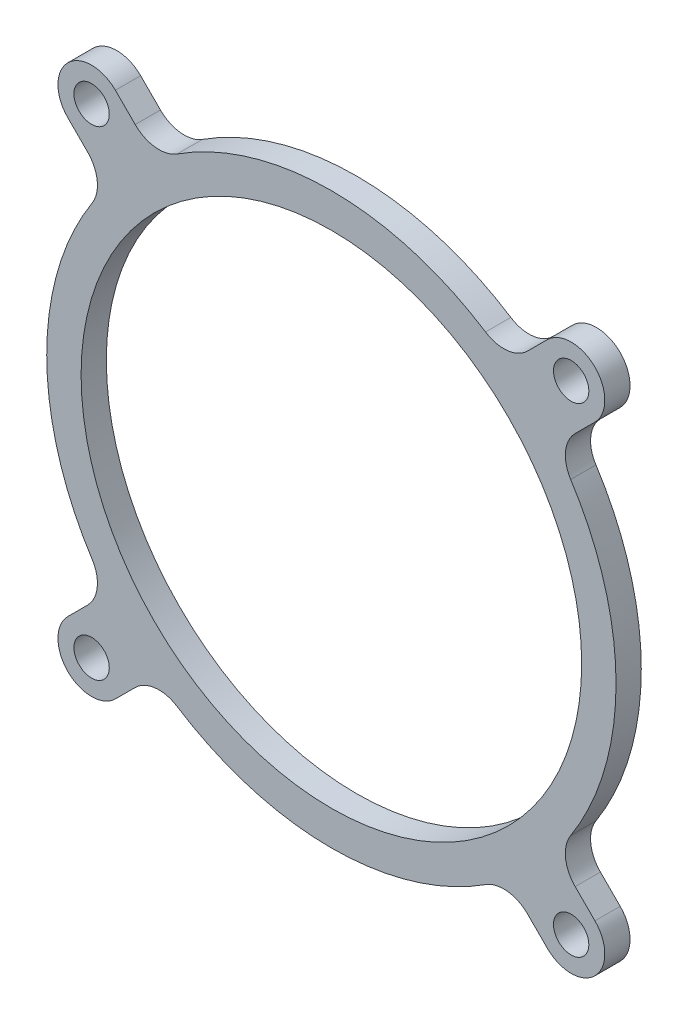
ISO-10303-21;
HEADER;
FILE_DESCRIPTION(('STEP AP214'),'2;1');
FILE_NAME('part.step','',(''),(''),'','','');
FILE_SCHEMA(('AUTOMOTIVE_DESIGN { 1 0 10303 214 1 1 1 1 }'));
ENDSEC;
DATA;
#1=APPLICATION_CONTEXT('core data for automotive mechanical design processes');
#2=APPLICATION_PROTOCOL_DEFINITION('international standard','automotive_design',2000,#1);
#3=PRODUCT_CONTEXT('',#1,'mechanical');
#4=PRODUCT('Part','Part','',(#3));
#5=PRODUCT_RELATED_PRODUCT_CATEGORY('part','',(#4));
#6=PRODUCT_DEFINITION_FORMATION('','',#4);
#7=PRODUCT_DEFINITION_CONTEXT('part definition',#1,'design');
#8=PRODUCT_DEFINITION('design','',#6,#7);
#9=PRODUCT_DEFINITION_SHAPE('','',#8);
#10=(LENGTH_UNIT() NAMED_UNIT(*) SI_UNIT(.MILLI.,.METRE.));
#11=(NAMED_UNIT(*) PLANE_ANGLE_UNIT() SI_UNIT($,.RADIAN.));
#12=(NAMED_UNIT(*) SI_UNIT($,.STERADIAN.) SOLID_ANGLE_UNIT());
#13=UNCERTAINTY_MEASURE_WITH_UNIT(LENGTH_MEASURE(1.E-05),#10,'distance_accuracy_value','');
#14=(GEOMETRIC_REPRESENTATION_CONTEXT(3) GLOBAL_UNCERTAINTY_ASSIGNED_CONTEXT((#13)) GLOBAL_UNIT_ASSIGNED_CONTEXT((#10,
#11,#12)) REPRESENTATION_CONTEXT('',''));
#15=CARTESIAN_POINT('',(0.,0.,0.));
#16=DIRECTION('',(0.,0.,1.));
#17=DIRECTION('',(1.,0.,0.));
#18=AXIS2_PLACEMENT_3D('',#15,#16,#17);
#19=CARTESIAN_POINT('',(52.049747468308,-52.0497474683077,3.));
#20=DIRECTION('',(0.,0.,1.));
#21=DIRECTION('',(1.,0.,0.));
#22=AXIS2_PLACEMENT_3D('',#19,#20,#21);
#23=PLANE('',#22);
#24=CARTESIAN_POINT('',(-4.94974746830807,4.94974746830784,3.));
#25=DIRECTION('',(0.,0.,1.));
#26=DIRECTION('',(1.,0.,0.));
#27=AXIS2_PLACEMENT_3D('',#24,#25,#26);
#28=CIRCLE('',#27,2.10000000000181);
#29=CARTESIAN_POINT('',(-2.84974746830626,4.94974746830784,3.));
#30=VERTEX_POINT('',#29);
#31=EDGE_CURVE('E455',#30,#30,#28,.T.);
#32=ORIENTED_EDGE('',*,*,#31,.F.);
#33=EDGE_LOOP('',(#32));
#34=FACE_BOUND('',#33,.T.);
#35=CARTESIAN_POINT('',(52.049747468308,-52.0497474683077,3.));
#36=DIRECTION('',(0.,0.,1.));
#37=DIRECTION('',(1.,0.,0.));
#38=AXIS2_PLACEMENT_3D('',#35,#36,#37);
#39=CIRCLE('',#38,2.0999999999985);
#40=CARTESIAN_POINT('',(54.1497474683065,-52.0497474683077,3.));
#41=VERTEX_POINT('',#40);
#42=EDGE_CURVE('E467',#41,#41,#39,.T.);
#43=ORIENTED_EDGE('',*,*,#42,.F.);
#44=EDGE_LOOP('',(#43));
#45=FACE_BOUND('',#44,.T.);
#46=CARTESIAN_POINT('',(52.049747468308,-52.0497474683077,3.));
#47=DIRECTION('',(0.,0.,1.));
#48=DIRECTION('',(1.,0.,0.));
#49=AXIS2_PLACEMENT_3D('',#46,#47,#48);
#50=CIRCLE('',#49,3.99999999998963);
#51=CARTESIAN_POINT('',(49.2213203435691,-54.8781745930466,3.));
#52=VERTEX_POINT('',#51);
#53=CARTESIAN_POINT('',(54.8781745930468,-49.2213203435689,3.));
#54=VERTEX_POINT('',#53);
#55=EDGE_CURVE('E277',#52,#54,#50,.T.);
#56=ORIENTED_EDGE('',*,*,#55,.T.);
#57=DIRECTION('',(-0.707106781186531,0.707106781186564,0.));
#58=VECTOR('',#57,1.);
#59=CARTESIAN_POINT('',(54.8781745930468,-49.2213203435689,3.));
#60=LINE('',#59,#58);
#61=CARTESIAN_POINT('',(52.526918716007,-46.870064466529,3.));
#62=VERTEX_POINT('',#61);
#63=EDGE_CURVE('E145',#54,#62,#60,.T.);
#64=ORIENTED_EDGE('',*,*,#63,.T.);
#65=CARTESIAN_POINT('',(55.3553458407532,-44.0416373417828,3.));
#66=DIRECTION('',(0.,0.,-1.));
#67=DIRECTION('',(1.,0.,0.));
#68=AXIS2_PLACEMENT_3D('',#65,#66,#67);
#69=CIRCLE('',#68,3.99999999999999);
#70=CARTESIAN_POINT('',(51.9928142334286,-41.8752160554806,3.));
#71=VERTEX_POINT('',#70);
#72=EDGE_CURVE('E340',#62,#71,#69,.T.);
#73=ORIENTED_EDGE('',*,*,#72,.T.);
#74=CARTESIAN_POINT('',(23.5499999999334,-23.5499999999476,3.));
#75=DIRECTION('',(0.,0.,1.));
#76=DIRECTION('',(1.,0.,0.));
#77=AXIS2_PLACEMENT_3D('',#74,#75,#76);
#78=CIRCLE('',#77,33.8350000000456);
#79=CARTESIAN_POINT('',(51.9928142335033,-5.22478394453042,3.));
#80=VERTEX_POINT('',#79);
#81=EDGE_CURVE('E359',#71,#80,#78,.T.);
#82=ORIENTED_EDGE('',*,*,#81,.T.);
#83=CARTESIAN_POINT('',(55.3553458408367,-3.05836265824198,3.));
#84=DIRECTION('',(0.,0.,-1.));
#85=DIRECTION('',(1.,0.,0.));
#86=AXIS2_PLACEMENT_3D('',#83,#84,#85);
#87=CIRCLE('',#86,4.);
#88=CARTESIAN_POINT('',(52.5269187160905,-0.22993553349579,3.));
#89=VERTEX_POINT('',#88);
#90=EDGE_CURVE('E356',#80,#89,#87,.T.);
#91=ORIENTED_EDGE('',*,*,#90,.T.);
#92=DIRECTION('',(0.707106781186545,0.70710678118655,0.));
#93=VECTOR('',#92,1.);
#94=CARTESIAN_POINT('',(54.8781745931514,2.12132034356506,3.));
#95=LINE('',#94,#93);
#96=CARTESIAN_POINT('',(54.8781745931516,2.12132034356488,3.));
#97=VERTEX_POINT('',#96);
#98=EDGE_CURVE('E358',#89,#97,#95,.T.);
#99=ORIENTED_EDGE('',*,*,#98,.T.);
#100=CARTESIAN_POINT('',(52.0497474684125,4.94974746830361,3.));
#101=DIRECTION('',(0.,0.,1.));
#102=DIRECTION('',(1.,0.,0.));
#103=AXIS2_PLACEMENT_3D('',#100,#101,#102);
#104=CIRCLE('',#103,3.99999999998965);
#105=CARTESIAN_POINT('',(49.2213203436736,7.7781745930428,3.));
#106=VERTEX_POINT('',#105);
#107=EDGE_CURVE('E361',#97,#106,#104,.T.);
#108=ORIENTED_EDGE('',*,*,#107,.T.);
#109=DIRECTION('',(-0.707106781186541,-0.707106781186554,0.));
#110=VECTOR('',#109,1.);
#111=CARTESIAN_POINT('',(49.2213203436736,7.7781745930428,3.));
#112=LINE('',#111,#110);
#113=CARTESIAN_POINT('',(46.8700644666735,5.42691871604261,3.));
#114=VERTEX_POINT('',#113);
#115=EDGE_CURVE('E367',#106,#114,#112,.T.);
#116=ORIENTED_EDGE('',*,*,#115,.T.);
#117=CARTESIAN_POINT('',(44.0416373419273,8.2553458407888,3.));
#118=DIRECTION('',(0.,0.,-1.));
#119=DIRECTION('',(1.,0.,0.));
#120=AXIS2_PLACEMENT_3D('',#117,#118,#119);
#121=CIRCLE('',#120,3.99999999999999);
#122=CARTESIAN_POINT('',(41.875216055624,4.89281423346494,3.));
#123=VERTEX_POINT('',#122);
#124=EDGE_CURVE('E369',#114,#123,#121,.T.);
#125=ORIENTED_EDGE('',*,*,#124,.T.);
#126=CARTESIAN_POINT('',(23.5500000000813,-23.5500000000242,3.));
#127=DIRECTION('',(0.,0.,1.));
#128=DIRECTION('',(-1.,0.,0.));
#129=AXIS2_PLACEMENT_3D('',#126,#127,#128);
#130=CIRCLE('',#129,33.8350000000457);
#131=CARTESIAN_POINT('',(5.22478394462314,4.8928142335194,3.));
#132=VERTEX_POINT('',#131);
#133=EDGE_CURVE('E371',#123,#132,#130,.T.);
#134=ORIENTED_EDGE('',*,*,#133,.T.);
#135=CARTESIAN_POINT('',(3.05836265832984,8.2553458408497,3.));
#136=DIRECTION('',(0.,0.,-1.));
#137=DIRECTION('',(1.,0.,0.));
#138=AXIS2_PLACEMENT_3D('',#135,#136,#137);
#139=CIRCLE('',#138,4.);
#140=CARTESIAN_POINT('',(0.229935533583649,5.42691871610351,3.));
#141=VERTEX_POINT('',#140);
#142=EDGE_CURVE('E373',#132,#141,#139,.T.);
#143=ORIENTED_EDGE('',*,*,#142,.T.);
#144=DIRECTION('',(-0.707106781186566,0.707106781186529,0.));
#145=VECTOR('',#144,1.);
#146=CARTESIAN_POINT('',(-2.12132034346029,7.77817459314733,3.));
#147=LINE('',#146,#145);
#148=CARTESIAN_POINT('',(-2.12132034346029,7.77817459314732,3.));
#149=VERTEX_POINT('',#148);
#150=EDGE_CURVE('E375',#141,#149,#147,.T.);
#151=ORIENTED_EDGE('',*,*,#150,.T.);
#152=CARTESIAN_POINT('',(-4.94974746819915,4.94974746840844,3.));
#153=DIRECTION('',(0.,0.,1.));
#154=DIRECTION('',(1.,0.,0.));
#155=AXIS2_PLACEMENT_3D('',#152,#153,#154);
#156=CIRCLE('',#155,3.99999999998964);
#157=CARTESIAN_POINT('',(-7.77817459293803,2.1213203436696,3.));
#158=VERTEX_POINT('',#157);
#159=EDGE_CURVE('E377',#149,#158,#156,.T.);
#160=ORIENTED_EDGE('',*,*,#159,.T.);
#161=DIRECTION('',(0.707106781186545,-0.70710678118655,0.));
#162=VECTOR('',#161,1.);
#163=CARTESIAN_POINT('',(-7.77817459293803,2.1213203436696,3.));
#164=LINE('',#163,#162);
#165=CARTESIAN_POINT('',(-5.42691871592922,-0.229935533339226,3.));
#166=VERTEX_POINT('',#165);
#167=EDGE_CURVE('E379',#158,#166,#164,.T.);
#168=ORIENTED_EDGE('',*,*,#167,.T.);
#169=CARTESIAN_POINT('',(-8.25534584067542,-3.05836265808541,3.));
#170=DIRECTION('',(0.,0.,-1.));
#171=DIRECTION('',(1.,0.,0.));
#172=AXIS2_PLACEMENT_3D('',#169,#170,#171);
#173=CIRCLE('',#172,4.);
#174=CARTESIAN_POINT('',(-4.89281423335789,-5.22478394439853,3.));
#175=VERTEX_POINT('',#174);
#176=EDGE_CURVE('E381',#166,#175,#173,.T.);
#177=ORIENTED_EDGE('',*,*,#176,.T.);
#178=CARTESIAN_POINT('',(23.55000000004,-23.5500000000001,3.));
#179=DIRECTION('',(0.,0.,1.));
#180=DIRECTION('',(1.,0.,0.));
#181=AXIS2_PLACEMENT_3D('',#178,#179,#180);
#182=CIRCLE('',#181,33.8350000000009);
#183=CARTESIAN_POINT('',(-4.89281423346648,-41.8752160554331,3.));
#184=VERTEX_POINT('',#183);
#185=EDGE_CURVE('E383',#175,#184,#182,.T.);
#186=ORIENTED_EDGE('',*,*,#185,.T.);
#187=CARTESIAN_POINT('',(-8.25534584079685,-44.0416373417262,3.));
#188=DIRECTION('',(0.,0.,-1.));
#189=DIRECTION('',(1.,0.,0.));
#190=AXIS2_PLACEMENT_3D('',#187,#188,#189);
#191=CIRCLE('',#190,4.);
#192=CARTESIAN_POINT('',(-5.42691871605065,-46.8700644664724,3.));
#193=VERTEX_POINT('',#192);
#194=EDGE_CURVE('E385',#184,#193,#191,.T.);
#195=ORIENTED_EDGE('',*,*,#194,.T.);
#196=DIRECTION('',(-0.707106781186544,-0.707106781186551,0.));
#197=VECTOR('',#196,1.);
#198=CARTESIAN_POINT('',(-7.77817459304254,-49.2213203434643,3.));
#199=LINE('',#198,#197);
#200=CARTESIAN_POINT('',(-7.77817459304274,-49.2213203434641,3.));
#201=VERTEX_POINT('',#200);
#202=EDGE_CURVE('E387',#193,#201,#199,.T.);
#203=ORIENTED_EDGE('',*,*,#202,.T.);
#204=CARTESIAN_POINT('',(-4.94974746830362,-52.0497474682028,3.));
#205=DIRECTION('',(0.,0.,1.));
#206=DIRECTION('',(1.,0.,0.));
#207=AXIS2_PLACEMENT_3D('',#204,#205,#206);
#208=CIRCLE('',#207,3.99999999998964);
#209=CARTESIAN_POINT('',(-2.1213203435648,-54.8781745929421,3.));
#210=VERTEX_POINT('',#209);
#211=EDGE_CURVE('E389',#201,#210,#208,.T.);
#212=ORIENTED_EDGE('',*,*,#211,.T.);
#213=DIRECTION('',(0.707106781186544,0.707106781186551,0.));
#214=VECTOR('',#213,1.);
#215=CARTESIAN_POINT('',(-2.1213203435648,-54.8781745929421,3.));
#216=LINE('',#215,#214);
#217=CARTESIAN_POINT('',(0.229935533390949,-52.5269187159863,3.));
#218=VERTEX_POINT('',#217);
#219=EDGE_CURVE('E391',#210,#218,#216,.T.);
#220=ORIENTED_EDGE('',*,*,#219,.T.);
#221=CARTESIAN_POINT('',(3.05836265813714,-55.3553458407325,3.));
#222=DIRECTION('',(0.,0.,-1.));
#223=DIRECTION('',(1.,0.,0.));
#224=AXIS2_PLACEMENT_3D('',#221,#222,#223);
#225=CIRCLE('',#224,3.99999999999999);
#226=CARTESIAN_POINT('',(5.22478394444227,-51.9928142334098,3.));
#227=VERTEX_POINT('',#226);
#228=EDGE_CURVE('E212',#218,#227,#225,.T.);
#229=ORIENTED_EDGE('',*,*,#228,.T.);
#230=CARTESIAN_POINT('',(23.5499999999759,-23.5499999999693,3.));
#231=DIRECTION('',(0.,0.,1.));
#232=DIRECTION('',(1.,0.,0.));
#233=AXIS2_PLACEMENT_3D('',#230,#231,#232);
#234=CIRCLE('',#233,33.8349999999999);
#235=CARTESIAN_POINT('',(41.8752160554813,-51.992814233428,3.));
#236=VERTEX_POINT('',#235);
#237=EDGE_CURVE('E206',#227,#236,#234,.T.);
#238=ORIENTED_EDGE('',*,*,#237,.T.);
#239=CARTESIAN_POINT('',(44.0416373417831,-55.3553458407528,3.));
#240=DIRECTION('',(0.,0.,-1.));
#241=DIRECTION('',(1.,0.,0.));
#242=AXIS2_PLACEMENT_3D('',#239,#240,#241);
#243=CIRCLE('',#242,4.);
#244=CARTESIAN_POINT('',(46.8700644665293,-52.5269187160066,3.));
#245=VERTEX_POINT('',#244);
#246=EDGE_CURVE('E210',#236,#245,#243,.T.);
#247=ORIENTED_EDGE('',*,*,#246,.T.);
#248=DIRECTION('',(0.707106781186534,-0.707106781186561,0.));
#249=VECTOR('',#248,1.);
#250=CARTESIAN_POINT('',(49.2213203435691,-54.8781745930466,3.));
#251=LINE('',#250,#249);
#252=EDGE_CURVE('E54',#245,#52,#251,.T.);
#253=ORIENTED_EDGE('',*,*,#252,.T.);
#254=EDGE_LOOP('',(#56,#64,#73,#82,#91,#99,#108,#116,#125,#134,#143,#151,#160,#168,#177,#186,
#195,#203,#212,#220,#229,#238,#247,#253));
#255=FACE_BOUND('',#254,.T.);
#256=CARTESIAN_POINT('',(23.5500000000813,-23.5500000000242,3.));
#257=DIRECTION('',(0.,0.,1.));
#258=DIRECTION('',(1.,0.,0.));
#259=AXIS2_PLACEMENT_3D('',#256,#257,#258);
#260=CIRCLE('',#259,29.75);
#261=CARTESIAN_POINT('',(53.3000000000813,-23.5500000000242,3.));
#262=VERTEX_POINT('',#261);
#263=EDGE_CURVE('E234',#262,#262,#260,.T.);
#264=ORIENTED_EDGE('',*,*,#263,.F.);
#265=EDGE_LOOP('',(#264));
#266=FACE_BOUND('',#265,.T.);
#267=CARTESIAN_POINT('',(-4.94974746830785,-52.0497474683081,3.));
#268=DIRECTION('',(0.,0.,1.));
#269=DIRECTION('',(1.,0.,0.));
#270=AXIS2_PLACEMENT_3D('',#267,#268,#269);
#271=CIRCLE('',#270,2.10000000000254);
#272=CARTESIAN_POINT('',(-2.84974746830531,-52.0497474683081,3.));
#273=VERTEX_POINT('',#272);
#274=EDGE_CURVE('E461',#273,#273,#271,.T.);
#275=ORIENTED_EDGE('',*,*,#274,.F.);
#276=EDGE_LOOP('',(#275));
#277=FACE_BOUND('',#276,.T.);
#278=CARTESIAN_POINT('',(52.0497474683079,4.94974746830806,3.));
#279=DIRECTION('',(0.,0.,1.));
#280=DIRECTION('',(1.,0.,0.));
#281=AXIS2_PLACEMENT_3D('',#278,#279,#280);
#282=CIRCLE('',#281,2.09999999999761);
#283=CARTESIAN_POINT('',(54.1497474683055,4.94974746830806,3.));
#284=VERTEX_POINT('',#283);
#285=EDGE_CURVE('E446',#284,#284,#282,.T.);
#286=ORIENTED_EDGE('',*,*,#285,.F.);
#287=EDGE_LOOP('',(#286));
#288=FACE_BOUND('',#287,.T.);
#289=ADVANCED_FACE('F37',(#34,#45,#255,#266,#277,#288),#23,.T.);
#290=CARTESIAN_POINT('',(52.049747468308,-52.0497474683077,0.));
#291=DIRECTION('',(0.,0.,1.));
#292=DIRECTION('',(1.,0.,0.));
#293=AXIS2_PLACEMENT_3D('',#290,#291,#292);
#294=PLANE('',#293);
#295=CARTESIAN_POINT('',(52.049747468308,-52.0497474683077,0.));
#296=DIRECTION('',(0.,0.,1.));
#297=DIRECTION('',(1.,0.,0.));
#298=AXIS2_PLACEMENT_3D('',#295,#296,#297);
#299=CIRCLE('',#298,3.99999999998963);
#300=CARTESIAN_POINT('',(49.2213203435691,-54.8781745930466,0.));
#301=VERTEX_POINT('',#300);
#302=CARTESIAN_POINT('',(54.8781745930468,-49.2213203435689,0.));
#303=VERTEX_POINT('',#302);
#304=EDGE_CURVE('E230',#301,#303,#299,.T.);
#305=ORIENTED_EDGE('',*,*,#304,.F.);
#306=DIRECTION('',(0.707106781186534,-0.707106781186561,0.));
#307=VECTOR('',#306,1.);
#308=CARTESIAN_POINT('',(49.2213203435691,-54.8781745930466,0.));
#309=LINE('',#308,#307);
#310=CARTESIAN_POINT('',(46.8700644665293,-52.5269187160066,0.));
#311=VERTEX_POINT('',#310);
#312=EDGE_CURVE('E137',#311,#301,#309,.T.);
#313=ORIENTED_EDGE('',*,*,#312,.F.);
#314=CARTESIAN_POINT('',(44.0416373417831,-55.3553458407528,0.));
#315=DIRECTION('',(0.,0.,-1.));
#316=DIRECTION('',(1.,0.,0.));
#317=AXIS2_PLACEMENT_3D('',#314,#315,#316);
#318=CIRCLE('',#317,4.);
#319=CARTESIAN_POINT('',(41.8752160554813,-51.992814233428,0.));
#320=VERTEX_POINT('',#319);
#321=EDGE_CURVE('E131',#320,#311,#318,.T.);
#322=ORIENTED_EDGE('',*,*,#321,.F.);
#323=CARTESIAN_POINT('',(23.5499999999759,-23.5499999999693,0.));
#324=DIRECTION('',(0.,0.,1.));
#325=DIRECTION('',(1.,0.,0.));
#326=AXIS2_PLACEMENT_3D('',#323,#324,#325);
#327=CIRCLE('',#326,33.8349999999999);
#328=CARTESIAN_POINT('',(5.22478394444227,-51.9928142334098,0.));
#329=VERTEX_POINT('',#328);
#330=EDGE_CURVE('E220',#329,#320,#327,.T.);
#331=ORIENTED_EDGE('',*,*,#330,.F.);
#332=CARTESIAN_POINT('',(3.05836265813714,-55.3553458407325,0.));
#333=DIRECTION('',(0.,0.,-1.));
#334=DIRECTION('',(1.,0.,0.));
#335=AXIS2_PLACEMENT_3D('',#332,#333,#334);
#336=CIRCLE('',#335,3.99999999999999);
#337=CARTESIAN_POINT('',(0.229935533390949,-52.5269187159863,0.));
#338=VERTEX_POINT('',#337);
#339=EDGE_CURVE('E272',#338,#329,#336,.T.);
#340=ORIENTED_EDGE('',*,*,#339,.F.);
#341=DIRECTION('',(0.707106781186544,0.707106781186551,0.));
#342=VECTOR('',#341,1.);
#343=CARTESIAN_POINT('',(-2.1213203435648,-54.8781745929421,0.));
#344=LINE('',#343,#342);
#345=CARTESIAN_POINT('',(-2.1213203435648,-54.8781745929421,0.));
#346=VERTEX_POINT('',#345);
#347=EDGE_CURVE('E270',#346,#338,#344,.T.);
#348=ORIENTED_EDGE('',*,*,#347,.F.);
#349=CARTESIAN_POINT('',(-4.94974746830362,-52.0497474682028,0.));
#350=DIRECTION('',(0.,0.,1.));
#351=DIRECTION('',(1.,0.,0.));
#352=AXIS2_PLACEMENT_3D('',#349,#350,#351);
#353=CIRCLE('',#352,3.99999999998964);
#354=CARTESIAN_POINT('',(-7.77817459304274,-49.2213203434641,0.));
#355=VERTEX_POINT('',#354);
#356=EDGE_CURVE('E268',#355,#346,#353,.T.);
#357=ORIENTED_EDGE('',*,*,#356,.F.);
#358=DIRECTION('',(-0.707106781186544,-0.707106781186551,0.));
#359=VECTOR('',#358,1.);
#360=CARTESIAN_POINT('',(-7.77817459304254,-49.2213203434643,0.));
#361=LINE('',#360,#359);
#362=CARTESIAN_POINT('',(-5.42691871605065,-46.8700644664724,0.));
#363=VERTEX_POINT('',#362);
#364=EDGE_CURVE('E266',#363,#355,#361,.T.);
#365=ORIENTED_EDGE('',*,*,#364,.F.);
#366=CARTESIAN_POINT('',(-8.25534584079685,-44.0416373417262,0.));
#367=DIRECTION('',(0.,0.,-1.));
#368=DIRECTION('',(1.,0.,0.));
#369=AXIS2_PLACEMENT_3D('',#366,#367,#368);
#370=CIRCLE('',#369,4.);
#371=CARTESIAN_POINT('',(-4.89281423346648,-41.8752160554331,0.));
#372=VERTEX_POINT('',#371);
#373=EDGE_CURVE('E264',#372,#363,#370,.T.);
#374=ORIENTED_EDGE('',*,*,#373,.F.);
#375=CARTESIAN_POINT('',(23.55000000004,-23.5500000000001,0.));
#376=DIRECTION('',(0.,0.,1.));
#377=DIRECTION('',(1.,0.,0.));
#378=AXIS2_PLACEMENT_3D('',#375,#376,#377);
#379=CIRCLE('',#378,33.8350000000009);
#380=CARTESIAN_POINT('',(-4.89281423335789,-5.22478394439853,0.));
#381=VERTEX_POINT('',#380);
#382=EDGE_CURVE('E262',#381,#372,#379,.T.);
#383=ORIENTED_EDGE('',*,*,#382,.F.);
#384=CARTESIAN_POINT('',(-8.25534584067542,-3.05836265808541,0.));
#385=DIRECTION('',(0.,0.,-1.));
#386=DIRECTION('',(1.,0.,0.));
#387=AXIS2_PLACEMENT_3D('',#384,#385,#386);
#388=CIRCLE('',#387,4.);
#389=CARTESIAN_POINT('',(-5.42691871592922,-0.229935533339226,0.));
#390=VERTEX_POINT('',#389);
#391=EDGE_CURVE('E260',#390,#381,#388,.T.);
#392=ORIENTED_EDGE('',*,*,#391,.F.);
#393=DIRECTION('',(0.707106781186545,-0.70710678118655,0.));
#394=VECTOR('',#393,1.);
#395=CARTESIAN_POINT('',(-7.77817459293803,2.1213203436696,0.));
#396=LINE('',#395,#394);
#397=CARTESIAN_POINT('',(-7.77817459293803,2.1213203436696,0.));
#398=VERTEX_POINT('',#397);
#399=EDGE_CURVE('E258',#398,#390,#396,.T.);
#400=ORIENTED_EDGE('',*,*,#399,.F.);
#401=CARTESIAN_POINT('',(-4.94974746819915,4.94974746840844,0.));
#402=DIRECTION('',(0.,0.,1.));
#403=DIRECTION('',(1.,0.,0.));
#404=AXIS2_PLACEMENT_3D('',#401,#402,#403);
#405=CIRCLE('',#404,3.99999999998964);
#406=CARTESIAN_POINT('',(-2.12132034346029,7.77817459314732,0.));
#407=VERTEX_POINT('',#406);
#408=EDGE_CURVE('E256',#407,#398,#405,.T.);
#409=ORIENTED_EDGE('',*,*,#408,.F.);
#410=DIRECTION('',(-0.707106781186566,0.707106781186529,0.));
#411=VECTOR('',#410,1.);
#412=CARTESIAN_POINT('',(-2.12132034346029,7.77817459314733,0.));
#413=LINE('',#412,#411);
#414=CARTESIAN_POINT('',(0.229935533583649,5.42691871610351,0.));
#415=VERTEX_POINT('',#414);
#416=EDGE_CURVE('E254',#415,#407,#413,.T.);
#417=ORIENTED_EDGE('',*,*,#416,.F.);
#418=CARTESIAN_POINT('',(3.05836265832984,8.2553458408497,0.));
#419=DIRECTION('',(0.,0.,-1.));
#420=DIRECTION('',(1.,0.,0.));
#421=AXIS2_PLACEMENT_3D('',#418,#419,#420);
#422=CIRCLE('',#421,4.);
#423=CARTESIAN_POINT('',(5.22478394462314,4.8928142335194,0.));
#424=VERTEX_POINT('',#423);
#425=EDGE_CURVE('E252',#424,#415,#422,.T.);
#426=ORIENTED_EDGE('',*,*,#425,.F.);
#427=CARTESIAN_POINT('',(23.5500000000813,-23.5500000000242,0.));
#428=DIRECTION('',(0.,0.,1.));
#429=DIRECTION('',(-1.,0.,0.));
#430=AXIS2_PLACEMENT_3D('',#427,#428,#429);
#431=CIRCLE('',#430,33.8350000000457);
#432=CARTESIAN_POINT('',(41.875216055624,4.89281423346494,0.));
#433=VERTEX_POINT('',#432);
#434=EDGE_CURVE('E250',#433,#424,#431,.T.);
#435=ORIENTED_EDGE('',*,*,#434,.F.);
#436=CARTESIAN_POINT('',(44.0416373419273,8.2553458407888,0.));
#437=DIRECTION('',(0.,0.,-1.));
#438=DIRECTION('',(1.,0.,0.));
#439=AXIS2_PLACEMENT_3D('',#436,#437,#438);
#440=CIRCLE('',#439,3.99999999999999);
#441=CARTESIAN_POINT('',(46.8700644666735,5.42691871604261,0.));
#442=VERTEX_POINT('',#441);
#443=EDGE_CURVE('E248',#442,#433,#440,.T.);
#444=ORIENTED_EDGE('',*,*,#443,.F.);
#445=DIRECTION('',(-0.707106781186541,-0.707106781186554,0.));
#446=VECTOR('',#445,1.);
#447=CARTESIAN_POINT('',(49.2213203436736,7.7781745930428,0.));
#448=LINE('',#447,#446);
#449=CARTESIAN_POINT('',(49.2213203436736,7.7781745930428,0.));
#450=VERTEX_POINT('',#449);
#451=EDGE_CURVE('E246',#450,#442,#448,.T.);
#452=ORIENTED_EDGE('',*,*,#451,.F.);
#453=CARTESIAN_POINT('',(52.0497474684125,4.94974746830361,0.));
#454=DIRECTION('',(0.,0.,1.));
#455=DIRECTION('',(1.,0.,0.));
#456=AXIS2_PLACEMENT_3D('',#453,#454,#455);
#457=CIRCLE('',#456,3.99999999998965);
#458=CARTESIAN_POINT('',(54.8781745931516,2.12132034356488,0.));
#459=VERTEX_POINT('',#458);
#460=EDGE_CURVE('E244',#459,#450,#457,.T.);
#461=ORIENTED_EDGE('',*,*,#460,.F.);
#462=DIRECTION('',(0.707106781186545,0.70710678118655,0.));
#463=VECTOR('',#462,1.);
#464=CARTESIAN_POINT('',(54.8781745931514,2.12132034356506,0.));
#465=LINE('',#464,#463);
#466=CARTESIAN_POINT('',(52.5269187160905,-0.22993553349579,0.));
#467=VERTEX_POINT('',#466);
#468=EDGE_CURVE('E242',#467,#459,#465,.T.);
#469=ORIENTED_EDGE('',*,*,#468,.F.);
#470=CARTESIAN_POINT('',(55.3553458408367,-3.05836265824198,0.));
#471=DIRECTION('',(0.,0.,-1.));
#472=DIRECTION('',(1.,0.,0.));
#473=AXIS2_PLACEMENT_3D('',#470,#471,#472);
#474=CIRCLE('',#473,4.);
#475=CARTESIAN_POINT('',(51.9928142335033,-5.22478394453042,0.));
#476=VERTEX_POINT('',#475);
#477=EDGE_CURVE('E240',#476,#467,#474,.T.);
#478=ORIENTED_EDGE('',*,*,#477,.F.);
#479=CARTESIAN_POINT('',(23.5499999999334,-23.5499999999476,0.));
#480=DIRECTION('',(0.,0.,1.));
#481=DIRECTION('',(1.,0.,0.));
#482=AXIS2_PLACEMENT_3D('',#479,#480,#481);
#483=CIRCLE('',#482,33.8350000000456);
#484=CARTESIAN_POINT('',(51.9928142334286,-41.8752160554806,0.));
#485=VERTEX_POINT('',#484);
#486=EDGE_CURVE('E238',#485,#476,#483,.T.);
#487=ORIENTED_EDGE('',*,*,#486,.F.);
#488=CARTESIAN_POINT('',(55.3553458407532,-44.0416373417828,0.));
#489=DIRECTION('',(0.,0.,-1.));
#490=DIRECTION('',(1.,0.,0.));
#491=AXIS2_PLACEMENT_3D('',#488,#489,#490);
#492=CIRCLE('',#491,3.99999999999999);
#493=CARTESIAN_POINT('',(52.526918716007,-46.870064466529,0.));
#494=VERTEX_POINT('',#493);
#495=EDGE_CURVE('E236',#494,#485,#492,.T.);
#496=ORIENTED_EDGE('',*,*,#495,.F.);
#497=DIRECTION('',(-0.707106781186531,0.707106781186564,0.));
#498=VECTOR('',#497,1.);
#499=CARTESIAN_POINT('',(54.8781745930468,-49.2213203435689,0.));
#500=LINE('',#499,#498);
#501=EDGE_CURVE('E233',#303,#494,#500,.T.);
#502=ORIENTED_EDGE('',*,*,#501,.F.);
#503=EDGE_LOOP('',(#305,#313,#322,#331,#340,#348,#357,#365,#374,#383,#392,#400,#409,#417,#426,
#435,#444,#452,#461,#469,#478,#487,#496,#502));
#504=FACE_BOUND('',#503,.T.);
#505=CARTESIAN_POINT('',(23.5500000000813,-23.5500000000242,0.));
#506=DIRECTION('',(0.,0.,1.));
#507=DIRECTION('',(1.,0.,0.));
#508=AXIS2_PLACEMENT_3D('',#505,#506,#507);
#509=CIRCLE('',#508,29.75);
#510=CARTESIAN_POINT('',(53.3000000000813,-23.5500000000242,0.));
#511=VERTEX_POINT('',#510);
#512=EDGE_CURVE('E470',#511,#511,#509,.T.);
#513=ORIENTED_EDGE('',*,*,#512,.T.);
#514=EDGE_LOOP('',(#513));
#515=FACE_BOUND('',#514,.T.);
#516=CARTESIAN_POINT('',(52.049747468308,-52.0497474683077,0.));
#517=DIRECTION('',(0.,0.,1.));
#518=DIRECTION('',(1.,0.,0.));
#519=AXIS2_PLACEMENT_3D('',#516,#517,#518);
#520=CIRCLE('',#519,2.0999999999985);
#521=CARTESIAN_POINT('',(54.1497474683065,-52.0497474683077,0.));
#522=VERTEX_POINT('',#521);
#523=EDGE_CURVE('E464',#522,#522,#520,.T.);
#524=ORIENTED_EDGE('',*,*,#523,.T.);
#525=EDGE_LOOP('',(#524));
#526=FACE_BOUND('',#525,.T.);
#527=CARTESIAN_POINT('',(-4.94974746830785,-52.0497474683081,0.));
#528=DIRECTION('',(0.,0.,1.));
#529=DIRECTION('',(1.,0.,0.));
#530=AXIS2_PLACEMENT_3D('',#527,#528,#529);
#531=CIRCLE('',#530,2.10000000000254);
#532=CARTESIAN_POINT('',(-2.84974746830531,-52.0497474683081,0.));
#533=VERTEX_POINT('',#532);
#534=EDGE_CURVE('E458',#533,#533,#531,.T.);
#535=ORIENTED_EDGE('',*,*,#534,.T.);
#536=EDGE_LOOP('',(#535));
#537=FACE_BOUND('',#536,.T.);
#538=CARTESIAN_POINT('',(-4.94974746830807,4.94974746830784,0.));
#539=DIRECTION('',(0.,0.,1.));
#540=DIRECTION('',(1.,0.,0.));
#541=AXIS2_PLACEMENT_3D('',#538,#539,#540);
#542=CIRCLE('',#541,2.10000000000181);
#543=CARTESIAN_POINT('',(-2.84974746830626,4.94974746830784,0.));
#544=VERTEX_POINT('',#543);
#545=EDGE_CURVE('E452',#544,#544,#542,.T.);
#546=ORIENTED_EDGE('',*,*,#545,.T.);
#547=EDGE_LOOP('',(#546));
#548=FACE_BOUND('',#547,.T.);
#549=CARTESIAN_POINT('',(52.0497474683079,4.94974746830806,0.));
#550=DIRECTION('',(0.,0.,1.));
#551=DIRECTION('',(1.,0.,0.));
#552=AXIS2_PLACEMENT_3D('',#549,#550,#551);
#553=CIRCLE('',#552,2.09999999999761);
#554=CARTESIAN_POINT('',(54.1497474683055,4.94974746830806,0.));
#555=VERTEX_POINT('',#554);
#556=EDGE_CURVE('E449',#555,#555,#553,.T.);
#557=ORIENTED_EDGE('',*,*,#556,.T.);
#558=EDGE_LOOP('',(#557));
#559=FACE_BOUND('',#558,.T.);
#560=ADVANCED_FACE('F344',(#504,#515,#526,#537,#548,#559),#294,.F.);
#561=CARTESIAN_POINT('',(52.049747468308,-52.0497474683077,3.));
#562=DIRECTION('',(0.,0.,-1.));
#563=DIRECTION('',(-1.,0.,0.));
#564=AXIS2_PLACEMENT_3D('',#561,#562,#563);
#565=CYLINDRICAL_SURFACE('',#564,3.99999999998963);
#566=ORIENTED_EDGE('',*,*,#304,.T.);
#567=DIRECTION('',(0.,0.,-1.));
#568=VECTOR('',#567,1.);
#569=CARTESIAN_POINT('',(54.8781745930468,-49.2213203435689,3.));
#570=LINE('',#569,#568);
#571=EDGE_CURVE('E11',#54,#303,#570,.T.);
#572=ORIENTED_EDGE('',*,*,#571,.F.);
#573=ORIENTED_EDGE('',*,*,#55,.F.);
#574=DIRECTION('',(0.,0.,-1.));
#575=VECTOR('',#574,1.);
#576=CARTESIAN_POINT('',(49.2213203435691,-54.8781745930466,3.));
#577=LINE('',#576,#575);
#578=EDGE_CURVE('E226',#52,#301,#577,.T.);
#579=ORIENTED_EDGE('',*,*,#578,.T.);
#580=EDGE_LOOP('',(#566,#572,#573,#579));
#581=FACE_BOUND('',#580,.T.);
#582=ADVANCED_FACE('F39',(#581),#565,.T.);
#583=CARTESIAN_POINT('',(54.8781745930468,-49.2213203435689,3.));
#584=DIRECTION('',(-0.707106781186564,-0.707106781186531,0.));
#585=DIRECTION('',(0.707106781186531,-0.707106781186564,0.));
#586=AXIS2_PLACEMENT_3D('',#583,#584,#585);
#587=PLANE('',#586);
#588=ORIENTED_EDGE('',*,*,#501,.T.);
#589=DIRECTION('',(0.,0.,-1.));
#590=VECTOR('',#589,1.);
#591=CARTESIAN_POINT('',(52.526918716007,-46.870064466529,3.));
#592=LINE('',#591,#590);
#593=EDGE_CURVE('E46',#62,#494,#592,.T.);
#594=ORIENTED_EDGE('',*,*,#593,.F.);
#595=ORIENTED_EDGE('',*,*,#63,.F.);
#596=ORIENTED_EDGE('',*,*,#571,.T.);
#597=EDGE_LOOP('',(#588,#594,#595,#596));
#598=FACE_BOUND('',#597,.T.);
#599=ADVANCED_FACE('F709',(#598),#587,.F.);
#600=CARTESIAN_POINT('',(55.3553458407532,-44.0416373417828,3.));
#601=DIRECTION('',(0.,0.,-1.));
#602=DIRECTION('',(-1.,0.,0.));
#603=AXIS2_PLACEMENT_3D('',#600,#601,#602);
#604=CYLINDRICAL_SURFACE('',#603,3.99999999999999);
#605=ORIENTED_EDGE('',*,*,#495,.T.);
#606=DIRECTION('',(0.,0.,-1.));
#607=VECTOR('',#606,1.);
#608=CARTESIAN_POINT('',(51.9928142334286,-41.8752160554806,3.));
#609=LINE('',#608,#607);
#610=EDGE_CURVE('E332',#71,#485,#609,.T.);
#611=ORIENTED_EDGE('',*,*,#610,.F.);
#612=ORIENTED_EDGE('',*,*,#72,.F.);
#613=ORIENTED_EDGE('',*,*,#593,.T.);
#614=EDGE_LOOP('',(#605,#611,#612,#613));
#615=FACE_BOUND('',#614,.T.);
#616=ADVANCED_FACE('F338',(#615),#604,.F.);
#617=CARTESIAN_POINT('',(23.5499999999334,-23.5499999999476,3.));
#618=DIRECTION('',(0.,0.,-1.));
#619=DIRECTION('',(-1.,0.,0.));
#620=AXIS2_PLACEMENT_3D('',#617,#618,#619);
#621=CYLINDRICAL_SURFACE('',#620,33.8350000000456);
#622=ORIENTED_EDGE('',*,*,#486,.T.);
#623=DIRECTION('',(0.,0.,-1.));
#624=VECTOR('',#623,1.);
#625=CARTESIAN_POINT('',(51.9928142335033,-5.22478394453042,3.));
#626=LINE('',#625,#624);
#627=EDGE_CURVE('E329',#80,#476,#626,.T.);
#628=ORIENTED_EDGE('',*,*,#627,.F.);
#629=ORIENTED_EDGE('',*,*,#81,.F.);
#630=ORIENTED_EDGE('',*,*,#610,.T.);
#631=EDGE_LOOP('',(#622,#628,#629,#630));
#632=FACE_BOUND('',#631,.T.);
#633=ADVANCED_FACE('F350',(#632),#621,.T.);
#634=CARTESIAN_POINT('',(55.3553458408367,-3.05836265824198,3.));
#635=DIRECTION('',(0.,0.,-1.));
#636=DIRECTION('',(-1.,0.,0.));
#637=AXIS2_PLACEMENT_3D('',#634,#635,#636);
#638=CYLINDRICAL_SURFACE('',#637,4.);
#639=ORIENTED_EDGE('',*,*,#477,.T.);
#640=DIRECTION('',(0.,0.,-1.));
#641=VECTOR('',#640,1.);
#642=CARTESIAN_POINT('',(52.5269187160905,-0.22993553349579,3.));
#643=LINE('',#642,#641);
#644=EDGE_CURVE('E326',#89,#467,#643,.T.);
#645=ORIENTED_EDGE('',*,*,#644,.F.);
#646=ORIENTED_EDGE('',*,*,#90,.F.);
#647=ORIENTED_EDGE('',*,*,#627,.T.);
#648=EDGE_LOOP('',(#639,#645,#646,#647));
#649=FACE_BOUND('',#648,.T.);
#650=ADVANCED_FACE('F354',(#649),#638,.F.);
#651=CARTESIAN_POINT('',(54.8781745931514,2.12132034356506,3.));
#652=DIRECTION('',(-0.70710678118655,0.707106781186545,0.));
#653=DIRECTION('',(-0.707106781186545,-0.70710678118655,0.));
#654=AXIS2_PLACEMENT_3D('',#651,#652,#653);
#655=PLANE('',#654);
#656=ORIENTED_EDGE('',*,*,#468,.T.);
#657=DIRECTION('',(0.,0.,-1.));
#658=VECTOR('',#657,1.);
#659=CARTESIAN_POINT('',(54.8781745931516,2.12132034356488,3.));
#660=LINE('',#659,#658);
#661=EDGE_CURVE('E323',#97,#459,#660,.T.);
#662=ORIENTED_EDGE('',*,*,#661,.F.);
#663=ORIENTED_EDGE('',*,*,#98,.F.);
#664=ORIENTED_EDGE('',*,*,#644,.T.);
#665=EDGE_LOOP('',(#656,#662,#663,#664));
#666=FACE_BOUND('',#665,.T.);
#667=ADVANCED_FACE('F674',(#666),#655,.F.);
#668=CARTESIAN_POINT('',(52.0497474684125,4.94974746830361,3.));
#669=DIRECTION('',(0.,0.,-1.));
#670=DIRECTION('',(-1.,0.,0.));
#671=AXIS2_PLACEMENT_3D('',#668,#669,#670);
#672=CYLINDRICAL_SURFACE('',#671,3.99999999998965);
#673=ORIENTED_EDGE('',*,*,#460,.T.);
#674=DIRECTION('',(0.,0.,-1.));
#675=VECTOR('',#674,1.);
#676=CARTESIAN_POINT('',(49.2213203436736,7.7781745930428,3.));
#677=LINE('',#676,#675);
#678=EDGE_CURVE('E320',#106,#450,#677,.T.);
#679=ORIENTED_EDGE('',*,*,#678,.F.);
#680=ORIENTED_EDGE('',*,*,#107,.F.);
#681=ORIENTED_EDGE('',*,*,#661,.T.);
#682=EDGE_LOOP('',(#673,#679,#680,#681));
#683=FACE_BOUND('',#682,.T.);
#684=ADVANCED_FACE('F664',(#683),#672,.T.);
#685=CARTESIAN_POINT('',(49.2213203436736,7.7781745930428,3.));
#686=DIRECTION('',(0.707106781186554,-0.707106781186541,0.));
#687=DIRECTION('',(0.707106781186541,0.707106781186554,0.));
#688=AXIS2_PLACEMENT_3D('',#685,#686,#687);
#689=PLANE('',#688);
#690=ORIENTED_EDGE('',*,*,#451,.T.);
#691=DIRECTION('',(0.,0.,-1.));
#692=VECTOR('',#691,1.);
#693=CARTESIAN_POINT('',(46.8700644666735,5.42691871604261,3.));
#694=LINE('',#693,#692);
#695=EDGE_CURVE('E317',#114,#442,#694,.T.);
#696=ORIENTED_EDGE('',*,*,#695,.F.);
#697=ORIENTED_EDGE('',*,*,#115,.F.);
#698=ORIENTED_EDGE('',*,*,#678,.T.);
#699=EDGE_LOOP('',(#690,#696,#697,#698));
#700=FACE_BOUND('',#699,.T.);
#701=ADVANCED_FACE('F654',(#700),#689,.F.);
#702=CARTESIAN_POINT('',(44.0416373419273,8.2553458407888,3.));
#703=DIRECTION('',(0.,0.,-1.));
#704=DIRECTION('',(-1.,0.,0.));
#705=AXIS2_PLACEMENT_3D('',#702,#703,#704);
#706=CYLINDRICAL_SURFACE('',#705,3.99999999999999);
#707=ORIENTED_EDGE('',*,*,#443,.T.);
#708=DIRECTION('',(0.,0.,-1.));
#709=VECTOR('',#708,1.);
#710=CARTESIAN_POINT('',(41.875216055624,4.89281423346494,3.));
#711=LINE('',#710,#709);
#712=EDGE_CURVE('E314',#123,#433,#711,.T.);
#713=ORIENTED_EDGE('',*,*,#712,.F.);
#714=ORIENTED_EDGE('',*,*,#124,.F.);
#715=ORIENTED_EDGE('',*,*,#695,.T.);
#716=EDGE_LOOP('',(#707,#713,#714,#715));
#717=FACE_BOUND('',#716,.T.);
#718=ADVANCED_FACE('F644',(#717),#706,.F.);
#719=CARTESIAN_POINT('',(23.5500000000813,-23.5500000000242,3.));
#720=DIRECTION('',(0.,0.,-1.));
#721=DIRECTION('',(-1.,0.,0.));
#722=AXIS2_PLACEMENT_3D('',#719,#720,#721);
#723=CYLINDRICAL_SURFACE('',#722,33.8350000000457);
#724=ORIENTED_EDGE('',*,*,#434,.T.);
#725=DIRECTION('',(0.,0.,-1.));
#726=VECTOR('',#725,1.);
#727=CARTESIAN_POINT('',(5.22478394462314,4.8928142335194,3.));
#728=LINE('',#727,#726);
#729=EDGE_CURVE('E311',#132,#424,#728,.T.);
#730=ORIENTED_EDGE('',*,*,#729,.F.);
#731=ORIENTED_EDGE('',*,*,#133,.F.);
#732=ORIENTED_EDGE('',*,*,#712,.T.);
#733=EDGE_LOOP('',(#724,#730,#731,#732));
#734=FACE_BOUND('',#733,.T.);
#735=ADVANCED_FACE('F634',(#734),#723,.T.);
#736=CARTESIAN_POINT('',(3.05836265832984,8.2553458408497,3.));
#737=DIRECTION('',(0.,0.,-1.));
#738=DIRECTION('',(-1.,0.,0.));
#739=AXIS2_PLACEMENT_3D('',#736,#737,#738);
#740=CYLINDRICAL_SURFACE('',#739,4.);
#741=ORIENTED_EDGE('',*,*,#425,.T.);
#742=DIRECTION('',(0.,0.,-1.));
#743=VECTOR('',#742,1.);
#744=CARTESIAN_POINT('',(0.229935533583649,5.42691871610351,3.));
#745=LINE('',#744,#743);
#746=EDGE_CURVE('E308',#141,#415,#745,.T.);
#747=ORIENTED_EDGE('',*,*,#746,.F.);
#748=ORIENTED_EDGE('',*,*,#142,.F.);
#749=ORIENTED_EDGE('',*,*,#729,.T.);
#750=EDGE_LOOP('',(#741,#747,#748,#749));
#751=FACE_BOUND('',#750,.T.);
#752=ADVANCED_FACE('F624',(#751),#740,.F.);
#753=CARTESIAN_POINT('',(-2.12132034346029,7.77817459314733,3.));
#754=DIRECTION('',(-0.707106781186529,-0.707106781186566,0.));
#755=DIRECTION('',(0.707106781186566,-0.707106781186529,0.));
#756=AXIS2_PLACEMENT_3D('',#753,#754,#755);
#757=PLANE('',#756);
#758=ORIENTED_EDGE('',*,*,#416,.T.);
#759=DIRECTION('',(0.,0.,-1.));
#760=VECTOR('',#759,1.);
#761=CARTESIAN_POINT('',(-2.12132034346029,7.77817459314732,3.));
#762=LINE('',#761,#760);
#763=EDGE_CURVE('E305',#149,#407,#762,.T.);
#764=ORIENTED_EDGE('',*,*,#763,.F.);
#765=ORIENTED_EDGE('',*,*,#150,.F.);
#766=ORIENTED_EDGE('',*,*,#746,.T.);
#767=EDGE_LOOP('',(#758,#764,#765,#766));
#768=FACE_BOUND('',#767,.T.);
#769=ADVANCED_FACE('F614',(#768),#757,.F.);
#770=CARTESIAN_POINT('',(-4.94974746819915,4.94974746840844,3.));
#771=DIRECTION('',(0.,0.,-1.));
#772=DIRECTION('',(-1.,0.,0.));
#773=AXIS2_PLACEMENT_3D('',#770,#771,#772);
#774=CYLINDRICAL_SURFACE('',#773,3.99999999998964);
#775=ORIENTED_EDGE('',*,*,#408,.T.);
#776=DIRECTION('',(0.,0.,-1.));
#777=VECTOR('',#776,1.);
#778=CARTESIAN_POINT('',(-7.77817459293803,2.1213203436696,3.));
#779=LINE('',#778,#777);
#780=EDGE_CURVE('E302',#158,#398,#779,.T.);
#781=ORIENTED_EDGE('',*,*,#780,.F.);
#782=ORIENTED_EDGE('',*,*,#159,.F.);
#783=ORIENTED_EDGE('',*,*,#763,.T.);
#784=EDGE_LOOP('',(#775,#781,#782,#783));
#785=FACE_BOUND('',#784,.T.);
#786=ADVANCED_FACE('F604',(#785),#774,.T.);
#787=CARTESIAN_POINT('',(-7.77817459293803,2.1213203436696,3.));
#788=DIRECTION('',(0.70710678118655,0.707106781186545,0.));
#789=DIRECTION('',(-0.707106781186545,0.70710678118655,0.));
#790=AXIS2_PLACEMENT_3D('',#787,#788,#789);
#791=PLANE('',#790);
#792=ORIENTED_EDGE('',*,*,#399,.T.);
#793=DIRECTION('',(0.,0.,-1.));
#794=VECTOR('',#793,1.);
#795=CARTESIAN_POINT('',(-5.42691871592922,-0.229935533339226,3.));
#796=LINE('',#795,#794);
#797=EDGE_CURVE('E299',#166,#390,#796,.T.);
#798=ORIENTED_EDGE('',*,*,#797,.F.);
#799=ORIENTED_EDGE('',*,*,#167,.F.);
#800=ORIENTED_EDGE('',*,*,#780,.T.);
#801=EDGE_LOOP('',(#792,#798,#799,#800));
#802=FACE_BOUND('',#801,.T.);
#803=ADVANCED_FACE('F594',(#802),#791,.F.);
#804=CARTESIAN_POINT('',(-8.25534584067542,-3.05836265808541,3.));
#805=DIRECTION('',(0.,0.,-1.));
#806=DIRECTION('',(-1.,0.,0.));
#807=AXIS2_PLACEMENT_3D('',#804,#805,#806);
#808=CYLINDRICAL_SURFACE('',#807,4.);
#809=ORIENTED_EDGE('',*,*,#391,.T.);
#810=DIRECTION('',(0.,0.,-1.));
#811=VECTOR('',#810,1.);
#812=CARTESIAN_POINT('',(-4.89281423335789,-5.22478394439853,3.));
#813=LINE('',#812,#811);
#814=EDGE_CURVE('E296',#175,#381,#813,.T.);
#815=ORIENTED_EDGE('',*,*,#814,.F.);
#816=ORIENTED_EDGE('',*,*,#176,.F.);
#817=ORIENTED_EDGE('',*,*,#797,.T.);
#818=EDGE_LOOP('',(#809,#815,#816,#817));
#819=FACE_BOUND('',#818,.T.);
#820=ADVANCED_FACE('F584',(#819),#808,.F.);
#821=CARTESIAN_POINT('',(23.55000000004,-23.5500000000001,3.));
#822=DIRECTION('',(0.,0.,-1.));
#823=DIRECTION('',(-1.,0.,0.));
#824=AXIS2_PLACEMENT_3D('',#821,#822,#823);
#825=CYLINDRICAL_SURFACE('',#824,33.8350000000009);
#826=ORIENTED_EDGE('',*,*,#382,.T.);
#827=DIRECTION('',(0.,0.,-1.));
#828=VECTOR('',#827,1.);
#829=CARTESIAN_POINT('',(-4.89281423346648,-41.8752160554331,3.));
#830=LINE('',#829,#828);
#831=EDGE_CURVE('E293',#184,#372,#830,.T.);
#832=ORIENTED_EDGE('',*,*,#831,.F.);
#833=ORIENTED_EDGE('',*,*,#185,.F.);
#834=ORIENTED_EDGE('',*,*,#814,.T.);
#835=EDGE_LOOP('',(#826,#832,#833,#834));
#836=FACE_BOUND('',#835,.T.);
#837=ADVANCED_FACE('F574',(#836),#825,.T.);
#838=CARTESIAN_POINT('',(-8.25534584079685,-44.0416373417262,3.));
#839=DIRECTION('',(0.,0.,-1.));
#840=DIRECTION('',(-1.,0.,0.));
#841=AXIS2_PLACEMENT_3D('',#838,#839,#840);
#842=CYLINDRICAL_SURFACE('',#841,4.);
#843=ORIENTED_EDGE('',*,*,#373,.T.);
#844=DIRECTION('',(0.,0.,-1.));
#845=VECTOR('',#844,1.);
#846=CARTESIAN_POINT('',(-5.42691871605065,-46.8700644664724,3.));
#847=LINE('',#846,#845);
#848=EDGE_CURVE('E290',#193,#363,#847,.T.);
#849=ORIENTED_EDGE('',*,*,#848,.F.);
#850=ORIENTED_EDGE('',*,*,#194,.F.);
#851=ORIENTED_EDGE('',*,*,#831,.T.);
#852=EDGE_LOOP('',(#843,#849,#850,#851));
#853=FACE_BOUND('',#852,.T.);
#854=ADVANCED_FACE('F564',(#853),#842,.F.);
#855=CARTESIAN_POINT('',(-7.77817459304254,-49.2213203434643,3.));
#856=DIRECTION('',(0.707106781186551,-0.707106781186544,0.));
#857=DIRECTION('',(0.707106781186544,0.707106781186551,0.));
#858=AXIS2_PLACEMENT_3D('',#855,#856,#857);
#859=PLANE('',#858);
#860=ORIENTED_EDGE('',*,*,#364,.T.);
#861=DIRECTION('',(0.,0.,-1.));
#862=VECTOR('',#861,1.);
#863=CARTESIAN_POINT('',(-7.77817459304274,-49.2213203434641,3.));
#864=LINE('',#863,#862);
#865=EDGE_CURVE('E287',#201,#355,#864,.T.);
#866=ORIENTED_EDGE('',*,*,#865,.F.);
#867=ORIENTED_EDGE('',*,*,#202,.F.);
#868=ORIENTED_EDGE('',*,*,#848,.T.);
#869=EDGE_LOOP('',(#860,#866,#867,#868));
#870=FACE_BOUND('',#869,.T.);
#871=ADVANCED_FACE('F554',(#870),#859,.F.);
#872=CARTESIAN_POINT('',(-4.94974746830362,-52.0497474682028,3.));
#873=DIRECTION('',(0.,0.,-1.));
#874=DIRECTION('',(-1.,0.,0.));
#875=AXIS2_PLACEMENT_3D('',#872,#873,#874);
#876=CYLINDRICAL_SURFACE('',#875,3.99999999998964);
#877=ORIENTED_EDGE('',*,*,#356,.T.);
#878=DIRECTION('',(0.,0.,-1.));
#879=VECTOR('',#878,1.);
#880=CARTESIAN_POINT('',(-2.1213203435648,-54.8781745929421,3.));
#881=LINE('',#880,#879);
#882=EDGE_CURVE('E284',#210,#346,#881,.T.);
#883=ORIENTED_EDGE('',*,*,#882,.F.);
#884=ORIENTED_EDGE('',*,*,#211,.F.);
#885=ORIENTED_EDGE('',*,*,#865,.T.);
#886=EDGE_LOOP('',(#877,#883,#884,#885));
#887=FACE_BOUND('',#886,.T.);
#888=ADVANCED_FACE('F545',(#887),#876,.T.);
#889=CARTESIAN_POINT('',(-2.1213203435648,-54.8781745929421,3.));
#890=DIRECTION('',(-0.707106781186551,0.707106781186544,0.));
#891=DIRECTION('',(-0.707106781186544,-0.707106781186551,0.));
#892=AXIS2_PLACEMENT_3D('',#889,#890,#891);
#893=PLANE('',#892);
#894=ORIENTED_EDGE('',*,*,#347,.T.);
#895=DIRECTION('',(0.,0.,-1.));
#896=VECTOR('',#895,1.);
#897=CARTESIAN_POINT('',(0.229935533390949,-52.5269187159863,3.));
#898=LINE('',#897,#896);
#899=EDGE_CURVE('E281',#218,#338,#898,.T.);
#900=ORIENTED_EDGE('',*,*,#899,.F.);
#901=ORIENTED_EDGE('',*,*,#219,.F.);
#902=ORIENTED_EDGE('',*,*,#882,.T.);
#903=EDGE_LOOP('',(#894,#900,#901,#902));
#904=FACE_BOUND('',#903,.T.);
#905=ADVANCED_FACE('F397',(#904),#893,.F.);
#906=CARTESIAN_POINT('',(3.05836265813714,-55.3553458407325,3.));
#907=DIRECTION('',(0.,0.,-1.));
#908=DIRECTION('',(-1.,0.,0.));
#909=AXIS2_PLACEMENT_3D('',#906,#907,#908);
#910=CYLINDRICAL_SURFACE('',#909,3.99999999999999);
#911=ORIENTED_EDGE('',*,*,#339,.T.);
#912=DIRECTION('',(0.,0.,-1.));
#913=VECTOR('',#912,1.);
#914=CARTESIAN_POINT('',(5.22478394444227,-51.9928142334098,3.));
#915=LINE('',#914,#913);
#916=EDGE_CURVE('E221',#227,#329,#915,.T.);
#917=ORIENTED_EDGE('',*,*,#916,.F.);
#918=ORIENTED_EDGE('',*,*,#228,.F.);
#919=ORIENTED_EDGE('',*,*,#899,.T.);
#920=EDGE_LOOP('',(#911,#917,#918,#919));
#921=FACE_BOUND('',#920,.T.);
#922=ADVANCED_FACE('F401',(#921),#910,.F.);
#923=CARTESIAN_POINT('',(23.5499999999759,-23.5499999999693,3.));
#924=DIRECTION('',(0.,0.,-1.));
#925=DIRECTION('',(-1.,0.,0.));
#926=AXIS2_PLACEMENT_3D('',#923,#924,#925);
#927=CYLINDRICAL_SURFACE('',#926,33.8349999999999);
#928=ORIENTED_EDGE('',*,*,#330,.T.);
#929=DIRECTION('',(0.,0.,-1.));
#930=VECTOR('',#929,1.);
#931=CARTESIAN_POINT('',(41.8752160554813,-51.992814233428,3.));
#932=LINE('',#931,#930);
#933=EDGE_CURVE('E217',#236,#320,#932,.T.);
#934=ORIENTED_EDGE('',*,*,#933,.F.);
#935=ORIENTED_EDGE('',*,*,#237,.F.);
#936=ORIENTED_EDGE('',*,*,#916,.T.);
#937=EDGE_LOOP('',(#928,#934,#935,#936));
#938=FACE_BOUND('',#937,.T.);
#939=ADVANCED_FACE('F218',(#938),#927,.T.);
#940=CARTESIAN_POINT('',(44.0416373417831,-55.3553458407528,3.));
#941=DIRECTION('',(0.,0.,-1.));
#942=DIRECTION('',(-1.,0.,0.));
#943=AXIS2_PLACEMENT_3D('',#940,#941,#942);
#944=CYLINDRICAL_SURFACE('',#943,4.);
#945=ORIENTED_EDGE('',*,*,#321,.T.);
#946=DIRECTION('',(0.,0.,-1.));
#947=VECTOR('',#946,1.);
#948=CARTESIAN_POINT('',(46.8700644665293,-52.5269187160066,3.));
#949=LINE('',#948,#947);
#950=EDGE_CURVE('E222',#245,#311,#949,.T.);
#951=ORIENTED_EDGE('',*,*,#950,.F.);
#952=ORIENTED_EDGE('',*,*,#246,.F.);
#953=ORIENTED_EDGE('',*,*,#933,.T.);
#954=EDGE_LOOP('',(#945,#951,#952,#953));
#955=FACE_BOUND('',#954,.T.);
#956=ADVANCED_FACE('F224',(#955),#944,.F.);
#957=CARTESIAN_POINT('',(49.2213203435691,-54.8781745930466,3.));
#958=DIRECTION('',(0.707106781186561,0.707106781186534,0.));
#959=DIRECTION('',(-0.707106781186534,0.707106781186561,0.));
#960=AXIS2_PLACEMENT_3D('',#957,#958,#959);
#961=PLANE('',#960);
#962=ORIENTED_EDGE('',*,*,#312,.T.);
#963=ORIENTED_EDGE('',*,*,#578,.F.);
#964=ORIENTED_EDGE('',*,*,#252,.F.);
#965=ORIENTED_EDGE('',*,*,#950,.T.);
#966=EDGE_LOOP('',(#962,#963,#964,#965));
#967=FACE_BOUND('',#966,.T.);
#968=ADVANCED_FACE('F405',(#967),#961,.F.);
#969=CARTESIAN_POINT('',(23.5500000000813,-23.5500000000242,3.));
#970=DIRECTION('',(0.,0.,-1.));
#971=DIRECTION('',(-1.,0.,0.));
#972=AXIS2_PLACEMENT_3D('',#969,#970,#971);
#973=CYLINDRICAL_SURFACE('',#972,29.75);
#974=ORIENTED_EDGE('',*,*,#263,.T.);
#975=EDGE_LOOP('',(#974));
#976=FACE_BOUND('',#975,.T.);
#977=ORIENTED_EDGE('',*,*,#512,.F.);
#978=EDGE_LOOP('',(#977));
#979=FACE_BOUND('',#978,.T.);
#980=ADVANCED_FACE('F407',(#976,#979),#973,.F.);
#981=CARTESIAN_POINT('',(52.049747468308,-52.0497474683077,3.));
#982=DIRECTION('',(0.,0.,-1.));
#983=DIRECTION('',(-1.,0.,0.));
#984=AXIS2_PLACEMENT_3D('',#981,#982,#983);
#985=CYLINDRICAL_SURFACE('',#984,2.0999999999985);
#986=ORIENTED_EDGE('',*,*,#42,.T.);
#987=EDGE_LOOP('',(#986));
#988=FACE_BOUND('',#987,.T.);
#989=ORIENTED_EDGE('',*,*,#523,.F.);
#990=EDGE_LOOP('',(#989));
#991=FACE_BOUND('',#990,.T.);
#992=ADVANCED_FACE('F413',(#988,#991),#985,.F.);
#993=CARTESIAN_POINT('',(-4.94974746830785,-52.0497474683081,3.));
#994=DIRECTION('',(0.,0.,-1.));
#995=DIRECTION('',(-1.,0.,0.));
#996=AXIS2_PLACEMENT_3D('',#993,#994,#995);
#997=CYLINDRICAL_SURFACE('',#996,2.10000000000254);
#998=ORIENTED_EDGE('',*,*,#274,.T.);
#999=EDGE_LOOP('',(#998));
#1000=FACE_BOUND('',#999,.T.);
#1001=ORIENTED_EDGE('',*,*,#534,.F.);
#1002=EDGE_LOOP('',(#1001));
#1003=FACE_BOUND('',#1002,.T.);
#1004=ADVANCED_FACE('F429',(#1000,#1003),#997,.F.);
#1005=CARTESIAN_POINT('',(-4.94974746830807,4.94974746830784,3.));
#1006=DIRECTION('',(0.,0.,-1.));
#1007=DIRECTION('',(-1.,0.,0.));
#1008=AXIS2_PLACEMENT_3D('',#1005,#1006,#1007);
#1009=CYLINDRICAL_SURFACE('',#1008,2.10000000000181);
#1010=ORIENTED_EDGE('',*,*,#31,.T.);
#1011=EDGE_LOOP('',(#1010));
#1012=FACE_BOUND('',#1011,.T.);
#1013=ORIENTED_EDGE('',*,*,#545,.F.);
#1014=EDGE_LOOP('',(#1013));
#1015=FACE_BOUND('',#1014,.T.);
#1016=ADVANCED_FACE('F433',(#1012,#1015),#1009,.F.);
#1017=CARTESIAN_POINT('',(52.0497474683079,4.94974746830806,3.));
#1018=DIRECTION('',(0.,0.,-1.));
#1019=DIRECTION('',(-1.,0.,0.));
#1020=AXIS2_PLACEMENT_3D('',#1017,#1018,#1019);
#1021=CYLINDRICAL_SURFACE('',#1020,2.09999999999761);
#1022=ORIENTED_EDGE('',*,*,#285,.T.);
#1023=EDGE_LOOP('',(#1022));
#1024=FACE_BOUND('',#1023,.T.);
#1025=ORIENTED_EDGE('',*,*,#556,.F.);
#1026=EDGE_LOOP('',(#1025));
#1027=FACE_BOUND('',#1026,.T.);
#1028=ADVANCED_FACE('F437',(#1024,#1027),#1021,.F.);
#1029=CLOSED_SHELL('',(#289,#560,#582,#599,#616,#633,#650,#667,#684,#701,#718,#735,#752,#769,
#786,#803,#820,#837,#854,#871,#888,#905,#922,#939,#956,#968,#980,#992,#1004,#1016,#1028));
#1030=MANIFOLD_SOLID_BREP('B2',#1029);
#1031=ADVANCED_BREP_SHAPE_REPRESENTATION('',(#18,#1030),#14);
#1032=SHAPE_DEFINITION_REPRESENTATION(#9,#1031);
ENDSEC;
END-ISO-10303-21;
